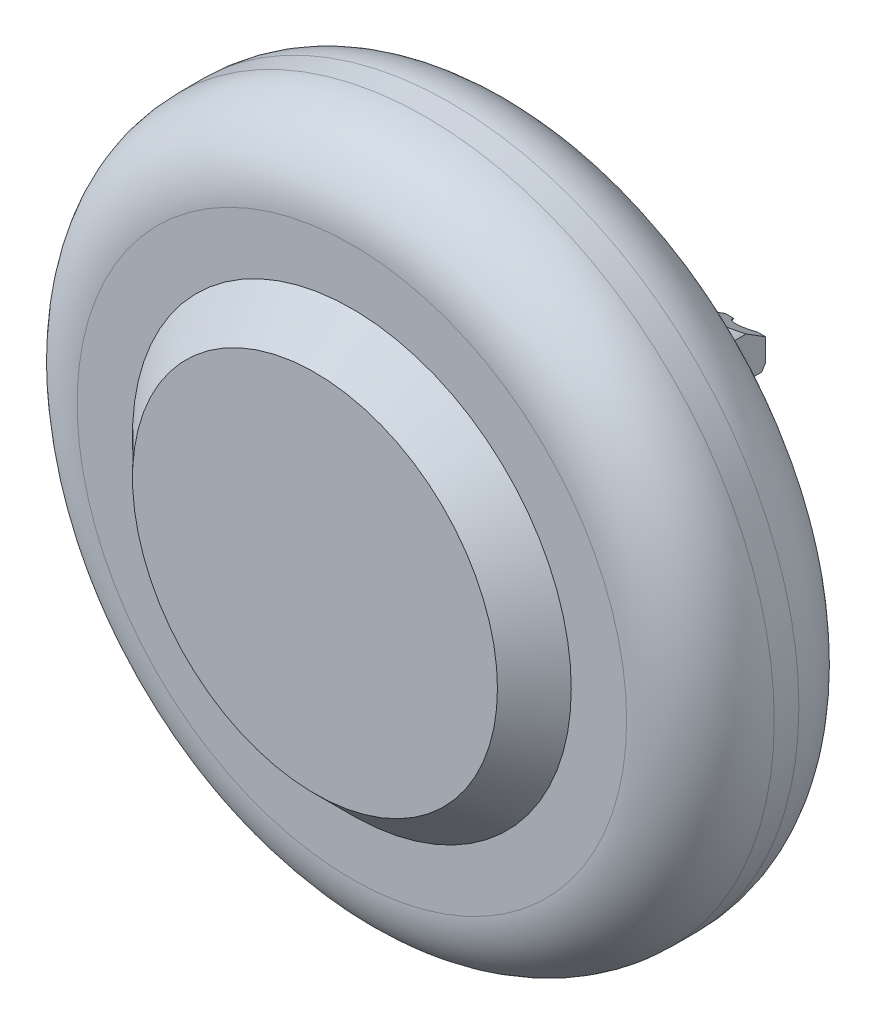
ISO-10303-21;
HEADER;
FILE_DESCRIPTION(('STEP AP214'),'2;1');
FILE_NAME('part.step','',(''),(''),'','','');
FILE_SCHEMA(('AUTOMOTIVE_DESIGN { 1 0 10303 214 1 1 1 1 }'));
ENDSEC;
DATA;
#1=APPLICATION_CONTEXT('core data for automotive mechanical design processes');
#2=APPLICATION_PROTOCOL_DEFINITION('international standard','automotive_design',2000,#1);
#3=PRODUCT_CONTEXT('',#1,'mechanical');
#4=PRODUCT('Part','Part','',(#3));
#5=PRODUCT_RELATED_PRODUCT_CATEGORY('part','',(#4));
#6=PRODUCT_DEFINITION_FORMATION('','',#4);
#7=PRODUCT_DEFINITION_CONTEXT('part definition',#1,'design');
#8=PRODUCT_DEFINITION('design','',#6,#7);
#9=PRODUCT_DEFINITION_SHAPE('','',#8);
#10=(LENGTH_UNIT() NAMED_UNIT(*) SI_UNIT(.MILLI.,.METRE.));
#11=(NAMED_UNIT(*) PLANE_ANGLE_UNIT() SI_UNIT($,.RADIAN.));
#12=(NAMED_UNIT(*) SI_UNIT($,.STERADIAN.) SOLID_ANGLE_UNIT());
#13=UNCERTAINTY_MEASURE_WITH_UNIT(LENGTH_MEASURE(1.E-05),#10,'distance_accuracy_value','');
#14=(GEOMETRIC_REPRESENTATION_CONTEXT(3) GLOBAL_UNCERTAINTY_ASSIGNED_CONTEXT((#13)) GLOBAL_UNIT_ASSIGNED_CONTEXT((#10,
#11,#12)) REPRESENTATION_CONTEXT('',''));
#15=CARTESIAN_POINT('',(0.,0.,0.));
#16=DIRECTION('',(0.,0.,1.));
#17=DIRECTION('',(1.,0.,0.));
#18=AXIS2_PLACEMENT_3D('',#15,#16,#17);
#19=CARTESIAN_POINT('',(0.,0.,-75.));
#20=DIRECTION('',(0.,0.,1.));
#21=DIRECTION('',(1.,0.,0.));
#22=AXIS2_PLACEMENT_3D('',#19,#20,#21);
#23=CYLINDRICAL_SURFACE('',#22,7.);
#24=CARTESIAN_POINT('',(0.,0.,-30.));
#25=DIRECTION('',(0.,0.,1.));
#26=DIRECTION('',(1.,0.,0.));
#27=AXIS2_PLACEMENT_3D('',#24,#25,#26);
#28=CIRCLE('',#27,7.);
#29=CARTESIAN_POINT('',(7.,0.,-30.));
#30=VERTEX_POINT('',#29);
#31=EDGE_CURVE('E125',#30,#30,#28,.F.);
#32=ORIENTED_EDGE('',*,*,#31,.T.);
#33=EDGE_LOOP('',(#32));
#34=FACE_BOUND('',#33,.T.);
#35=DIRECTION('',(0.,0.,1.));
#36=VECTOR('',#35,1.);
#37=CARTESIAN_POINT('',(4.925,4.97437181963713,-75.));
#38=LINE('',#37,#36);
#39=CARTESIAN_POINT('',(4.925,4.97437181963713,-70.2410050885806));
#40=VERTEX_POINT('',#39);
#41=CARTESIAN_POINT('',(4.925,4.97437181963713,-35.));
#42=VERTEX_POINT('',#41);
#43=EDGE_CURVE('E224',#40,#42,#38,.T.);
#44=ORIENTED_EDGE('',*,*,#43,.F.);
#45=CARTESIAN_POINT('',(0.,0.,-78.2));
#46=DIRECTION('',(0.,-0.847998304005088,0.52999894000318));
#47=DIRECTION('',(0.,0.52999894000318,0.847998304005088));
#48=AXIS2_PLACEMENT_3D('',#45,#46,#47);
#49=ELLIPSE('',#48,13.2075735848792,7.);
#50=CARTESIAN_POINT('',(-4.925,4.97437181963713,-70.2410050885806));
#51=VERTEX_POINT('',#50);
#52=EDGE_CURVE('E242',#51,#40,#49,.F.);
#53=ORIENTED_EDGE('',*,*,#52,.F.);
#54=DIRECTION('',(0.,0.,1.));
#55=VECTOR('',#54,1.);
#56=CARTESIAN_POINT('',(-4.925,4.97437181963713,-75.));
#57=LINE('',#56,#55);
#58=CARTESIAN_POINT('',(-4.925,4.97437181963713,-35.));
#59=VERTEX_POINT('',#58);
#60=EDGE_CURVE('E117',#59,#51,#57,.F.);
#61=ORIENTED_EDGE('',*,*,#60,.F.);
#62=CARTESIAN_POINT('',(0.,0.,-35.));
#63=DIRECTION('',(0.,0.,-1.));
#64=DIRECTION('',(-1.,0.,0.));
#65=AXIS2_PLACEMENT_3D('',#62,#63,#64);
#66=CIRCLE('',#65,7.);
#67=CARTESIAN_POINT('',(-4.925,-4.97437181963713,-35.));
#68=VERTEX_POINT('',#67);
#69=EDGE_CURVE('E127',#68,#59,#66,.T.);
#70=ORIENTED_EDGE('',*,*,#69,.F.);
#71=DIRECTION('',(0.,0.,1.));
#72=VECTOR('',#71,1.);
#73=CARTESIAN_POINT('',(-4.925,-4.97437181963713,-75.));
#74=LINE('',#73,#72);
#75=CARTESIAN_POINT('',(-4.925,-4.97437181963713,-74.0000000000001));
#76=VERTEX_POINT('',#75);
#77=EDGE_CURVE('E228',#76,#68,#74,.T.);
#78=ORIENTED_EDGE('',*,*,#77,.F.);
#79=CARTESIAN_POINT('',(0.,0.,-74.0000000000001));
#80=DIRECTION('',(0.,0.,-1.));
#81=DIRECTION('',(-1.,0.,0.));
#82=AXIS2_PLACEMENT_3D('',#79,#80,#81);
#83=CIRCLE('',#82,7.);
#84=CARTESIAN_POINT('',(4.925,-4.97437181963713,-74.0000000000001));
#85=VERTEX_POINT('',#84);
#86=EDGE_CURVE('E62',#76,#85,#83,.F.);
#87=ORIENTED_EDGE('',*,*,#86,.T.);
#88=DIRECTION('',(0.,0.,1.));
#89=VECTOR('',#88,1.);
#90=CARTESIAN_POINT('',(4.925,-4.97437181963713,-75.));
#91=LINE('',#90,#89);
#92=CARTESIAN_POINT('',(4.925,-4.97437181963713,-35.));
#93=VERTEX_POINT('',#92);
#94=EDGE_CURVE('E226',#93,#85,#91,.F.);
#95=ORIENTED_EDGE('',*,*,#94,.F.);
#96=EDGE_CURVE('E135',#42,#93,#66,.T.);
#97=ORIENTED_EDGE('',*,*,#96,.F.);
#98=EDGE_LOOP('',(#44,#53,#61,#70,#78,#87,#95,#97));
#99=FACE_BOUND('',#98,.T.);
#100=ADVANCED_FACE('F39',(#34,#99),#23,.T.);
#101=CARTESIAN_POINT('',(0.,0.,-75.));
#102=DIRECTION('',(0.,0.,-1.));
#103=DIRECTION('',(-1.,0.,0.));
#104=AXIS2_PLACEMENT_3D('',#101,#102,#103);
#105=PLANE('',#104);
#106=DIRECTION('',(1.,0.,0.));
#107=VECTOR('',#106,1.);
#108=CARTESIAN_POINT('',(-85.001,2.,-75.));
#109=LINE('',#108,#107);
#110=CARTESIAN_POINT('',(2.87228132326902,2.,-75.));
#111=VERTEX_POINT('',#110);
#112=CARTESIAN_POINT('',(4.925,2.,-75.));
#113=VERTEX_POINT('',#112);
#114=EDGE_CURVE('E54',#111,#113,#109,.T.);
#115=ORIENTED_EDGE('',*,*,#114,.T.);
#116=DIRECTION('',(0.,-1.,0.));
#117=VECTOR('',#116,1.);
#118=CARTESIAN_POINT('',(4.925,0.,-75.));
#119=LINE('',#118,#117);
#120=CARTESIAN_POINT('',(4.925,-3.42700671140307,-75.));
#121=VERTEX_POINT('',#120);
#122=EDGE_CURVE('E124',#113,#121,#119,.T.);
#123=ORIENTED_EDGE('',*,*,#122,.T.);
#124=CARTESIAN_POINT('',(0.,0.,-75.));
#125=DIRECTION('',(0.,0.,-1.));
#126=DIRECTION('',(-1.,0.,0.));
#127=AXIS2_PLACEMENT_3D('',#124,#125,#126);
#128=CIRCLE('',#127,6.00000000000014);
#129=CARTESIAN_POINT('',(-4.925,-3.42700671140307,-75.));
#130=VERTEX_POINT('',#129);
#131=EDGE_CURVE('E123',#121,#130,#128,.T.);
#132=ORIENTED_EDGE('',*,*,#131,.T.);
#133=DIRECTION('',(0.,1.,0.));
#134=VECTOR('',#133,1.);
#135=CARTESIAN_POINT('',(-4.925,0.,-75.));
#136=LINE('',#135,#134);
#137=CARTESIAN_POINT('',(-4.925,2.,-75.));
#138=VERTEX_POINT('',#137);
#139=EDGE_CURVE('E114',#130,#138,#136,.T.);
#140=ORIENTED_EDGE('',*,*,#139,.T.);
#141=CARTESIAN_POINT('',(-2.87228132326901,2.,-75.));
#142=VERTEX_POINT('',#141);
#143=EDGE_CURVE('E98',#138,#142,#109,.T.);
#144=ORIENTED_EDGE('',*,*,#143,.T.);
#145=CARTESIAN_POINT('',(0.,0.,-75.));
#146=DIRECTION('',(0.,0.,-1.));
#147=DIRECTION('',(-1.,0.,0.));
#148=AXIS2_PLACEMENT_3D('',#145,#146,#147);
#149=CIRCLE('',#148,3.5);
#150=EDGE_CURVE('E108',#111,#142,#149,.T.);
#151=ORIENTED_EDGE('',*,*,#150,.F.);
#152=EDGE_LOOP('',(#115,#123,#132,#140,#144,#151));
#153=FACE_BOUND('',#152,.T.);
#154=ADVANCED_FACE('F121',(#153),#105,.T.);
#155=CARTESIAN_POINT('',(0.,0.,21.));
#156=DIRECTION('',(0.,0.,-1.));
#157=DIRECTION('',(-1.,0.,0.));
#158=AXIS2_PLACEMENT_3D('',#155,#156,#157);
#159=CYLINDRICAL_SURFACE('',#158,85.);
#160=CARTESIAN_POINT('',(0.,0.,-3.00000000000001));
#161=DIRECTION('',(0.,0.,1.));
#162=DIRECTION('',(1.,0.,0.));
#163=AXIS2_PLACEMENT_3D('',#160,#161,#162);
#164=CIRCLE('',#163,85.);
#165=CARTESIAN_POINT('',(-85.,0.,-3.00000000000001));
#166=VERTEX_POINT('',#165);
#167=EDGE_CURVE('E401',#166,#166,#164,.T.);
#168=CARTESIAN_POINT('',(0.,0.,3.));
#169=DIRECTION('',(0.,0.,1.));
#170=DIRECTION('',(1.,0.,0.));
#171=AXIS2_PLACEMENT_3D('',#168,#169,#170);
#172=CIRCLE('',#171,85.);
#173=CARTESIAN_POINT('',(-85.,0.,3.));
#174=VERTEX_POINT('',#173);
#175=EDGE_CURVE('E167',#174,#174,#172,.F.);
#176=CARTESIAN_POINT('',(-85.,0.,-3.00000000000001));
#177=CARTESIAN_POINT('',(-85.,0.,-2.93750000000001));
#178=CARTESIAN_POINT('',(-85.,0.,-2.87500000000001));
#179=CARTESIAN_POINT('',(-85.,0.,-2.75000000000001));
#180=CARTESIAN_POINT('',(-85.,0.,-2.68750000000001));
#181=CARTESIAN_POINT('',(-85.,0.,-2.56250000000001));
#182=CARTESIAN_POINT('',(-85.,0.,-2.50000000000001));
#183=CARTESIAN_POINT('',(-85.,0.,-2.37500000000001));
#184=CARTESIAN_POINT('',(-85.,0.,-2.31250000000001));
#185=CARTESIAN_POINT('',(-85.,0.,-2.18750000000001));
#186=CARTESIAN_POINT('',(-85.,0.,-2.12500000000001));
#187=CARTESIAN_POINT('',(-85.,0.,-2.00000000000001));
#188=CARTESIAN_POINT('',(-85.,0.,-1.93750000000001));
#189=CARTESIAN_POINT('',(-85.,0.,-1.81250000000001));
#190=CARTESIAN_POINT('',(-85.,0.,-1.75000000000001));
#191=CARTESIAN_POINT('',(-85.,0.,-1.62500000000001));
#192=CARTESIAN_POINT('',(-85.,0.,-1.56250000000001));
#193=CARTESIAN_POINT('',(-85.,0.,-1.43750000000001));
#194=CARTESIAN_POINT('',(-85.,0.,-1.37500000000001));
#195=CARTESIAN_POINT('',(-85.,0.,-1.25000000000001));
#196=CARTESIAN_POINT('',(-85.,0.,-1.18750000000001));
#197=CARTESIAN_POINT('',(-85.,0.,-1.06250000000001));
#198=CARTESIAN_POINT('',(-85.,0.,-1.00000000000001));
#199=CARTESIAN_POINT('',(-85.,0.,-0.875000000000008));
#200=CARTESIAN_POINT('',(-85.,0.,-0.812500000000008));
#201=CARTESIAN_POINT('',(-85.,0.,-0.687500000000008));
#202=CARTESIAN_POINT('',(-85.,0.,-0.625000000000008));
#203=CARTESIAN_POINT('',(-85.,0.,-0.500000000000007));
#204=CARTESIAN_POINT('',(-85.,0.,-0.437500000000007));
#205=CARTESIAN_POINT('',(-85.,0.,-0.312500000000007));
#206=CARTESIAN_POINT('',(-85.,0.,-0.250000000000007));
#207=CARTESIAN_POINT('',(-85.,0.,-0.125000000000007));
#208=CARTESIAN_POINT('',(-85.,0.,-0.062500000000007));
#209=CARTESIAN_POINT('',(-85.,0.,0.0624999999999931));
#210=CARTESIAN_POINT('',(-85.,0.,0.124999999999993));
#211=CARTESIAN_POINT('',(-85.,0.,0.249999999999993));
#212=CARTESIAN_POINT('',(-85.,0.,0.312499999999993));
#213=CARTESIAN_POINT('',(-85.,0.,0.437499999999993));
#214=CARTESIAN_POINT('',(-85.,0.,0.499999999999994));
#215=CARTESIAN_POINT('',(-85.,0.,0.624999999999994));
#216=CARTESIAN_POINT('',(-85.,0.,0.687499999999994));
#217=CARTESIAN_POINT('',(-85.,0.,0.812499999999994));
#218=CARTESIAN_POINT('',(-85.,0.,0.874999999999994));
#219=CARTESIAN_POINT('',(-85.,0.,0.999999999999994));
#220=CARTESIAN_POINT('',(-85.,0.,1.06249999999999));
#221=CARTESIAN_POINT('',(-85.,0.,1.18749999999999));
#222=CARTESIAN_POINT('',(-85.,0.,1.24999999999999));
#223=CARTESIAN_POINT('',(-85.,0.,1.37499999999999));
#224=CARTESIAN_POINT('',(-85.,0.,1.43749999999999));
#225=CARTESIAN_POINT('',(-85.,0.,1.56249999999999));
#226=CARTESIAN_POINT('',(-85.,0.,1.62499999999999));
#227=CARTESIAN_POINT('',(-85.,0.,1.74999999999999));
#228=CARTESIAN_POINT('',(-85.,0.,1.81249999999999));
#229=CARTESIAN_POINT('',(-85.,0.,1.93749999999999));
#230=CARTESIAN_POINT('',(-85.,0.,1.99999999999999));
#231=CARTESIAN_POINT('',(-85.,0.,2.125));
#232=CARTESIAN_POINT('',(-85.,0.,2.1875));
#233=CARTESIAN_POINT('',(-85.,0.,2.3125));
#234=CARTESIAN_POINT('',(-85.,0.,2.375));
#235=CARTESIAN_POINT('',(-85.,0.,2.5));
#236=CARTESIAN_POINT('',(-85.,0.,2.5625));
#237=CARTESIAN_POINT('',(-85.,0.,2.6875));
#238=CARTESIAN_POINT('',(-85.,0.,2.75));
#239=CARTESIAN_POINT('',(-85.,0.,2.875));
#240=CARTESIAN_POINT('',(-85.,0.,2.9375));
#241=CARTESIAN_POINT('',(-85.,0.,3.));
#242=B_SPLINE_CURVE_WITH_KNOTS('',3,(#176,#177,#178,#179,#180,#181,#182,#183,#184,#185,#186,
#187,#188,#189,#190,#191,#192,#193,#194,#195,#196,#197,#198,#199,#200,#201,#202,#203,#204,#205,
#206,#207,#208,#209,#210,#211,#212,#213,#214,#215,#216,#217,#218,#219,#220,#221,#222,#223,#224,
#225,#226,#227,#228,#229,#230,#231,#232,#233,#234,#235,#236,#237,#238,#239,#240,#241),
.UNSPECIFIED.,.F.,.F.,(4,2,2,2,2,2,2,2,2,2,2,2,2,2,2,2,2,2,2,2,2,2,2,2,2,2,2,2,2,2,2,2,4),(0.,
0.1875,0.375,0.5625,0.750000000000001,0.937500000000001,1.125,1.3125,1.5,1.6875,1.875,2.0625,
2.25,2.4375,2.625,2.8125,3.,3.1875,3.375,3.5625,3.75,3.9375,4.125,4.3125,4.5,4.6875,4.875,
5.0625,5.25,5.4375,5.62500000000001,5.81250000000001,6.00000000000001),.UNSPECIFIED.);
#243=EDGE_CURVE('BSEAM180',#166,#174,#242,.T.);
#244=ORIENTED_EDGE('',*,*,#167,.T.);
#245=ORIENTED_EDGE('',*,*,#175,.T.);
#246=ORIENTED_EDGE('',*,*,#243,.T.);
#247=ORIENTED_EDGE('',*,*,#243,.F.);
#248=EDGE_LOOP('',(#244,#246,#245,#247));
#249=FACE_BOUND('',#248,.T.);
#250=ADVANCED_FACE('F180',(#249),#159,.T.);
#251=CARTESIAN_POINT('',(0.,0.,21.));
#252=DIRECTION('',(0.,0.,1.));
#253=DIRECTION('',(1.,0.,0.));
#254=AXIS2_PLACEMENT_3D('',#251,#252,#253);
#255=PLANE('',#254);
#256=CARTESIAN_POINT('',(0.,0.,21.));
#257=DIRECTION('',(0.,0.,1.));
#258=DIRECTION('',(1.,0.,0.));
#259=AXIS2_PLACEMENT_3D('',#256,#257,#258);
#260=CIRCLE('',#259,67.);
#261=CARTESIAN_POINT('',(67.,0.,21.));
#262=VERTEX_POINT('',#261);
#263=EDGE_CURVE('E12',#262,#262,#260,.T.);
#264=ORIENTED_EDGE('',*,*,#263,.T.);
#265=EDGE_LOOP('',(#264));
#266=FACE_BOUND('',#265,.T.);
#267=CARTESIAN_POINT('',(0.,0.,21.));
#268=DIRECTION('',(0.,0.,1.));
#269=DIRECTION('',(1.,0.,0.));
#270=AXIS2_PLACEMENT_3D('',#267,#268,#269);
#271=CIRCLE('',#270,53.4999999999999);
#272=CARTESIAN_POINT('',(53.4999999999999,0.,21.));
#273=VERTEX_POINT('',#272);
#274=EDGE_CURVE('E130',#273,#273,#271,.F.);
#275=ORIENTED_EDGE('',*,*,#274,.T.);
#276=EDGE_LOOP('',(#275));
#277=FACE_BOUND('',#276,.T.);
#278=ADVANCED_FACE('F194',(#266,#277),#255,.T.);
#279=CARTESIAN_POINT('',(0.,0.,-21.));
#280=DIRECTION('',(0.,0.,1.));
#281=DIRECTION('',(1.,0.,0.));
#282=AXIS2_PLACEMENT_3D('',#279,#280,#281);
#283=PLANE('',#282);
#284=CARTESIAN_POINT('',(0.,0.,-21.));
#285=DIRECTION('',(0.,0.,1.));
#286=DIRECTION('',(1.,0.,0.));
#287=AXIS2_PLACEMENT_3D('',#284,#285,#286);
#288=CIRCLE('',#287,67.);
#289=CARTESIAN_POINT('',(67.,0.,-21.));
#290=VERTEX_POINT('',#289);
#291=EDGE_CURVE('E47',#290,#290,#288,.F.);
#292=ORIENTED_EDGE('',*,*,#291,.T.);
#293=EDGE_LOOP('',(#292));
#294=FACE_BOUND('',#293,.T.);
#295=CARTESIAN_POINT('',(0.,0.,-21.));
#296=DIRECTION('',(0.,0.,1.));
#297=DIRECTION('',(1.,0.,0.));
#298=AXIS2_PLACEMENT_3D('',#295,#296,#297);
#299=CIRCLE('',#298,53.4999999999998);
#300=CARTESIAN_POINT('',(53.4999999999998,0.,-21.));
#301=VERTEX_POINT('',#300);
#302=EDGE_CURVE('E215',#301,#301,#299,.T.);
#303=ORIENTED_EDGE('',*,*,#302,.T.);
#304=EDGE_LOOP('',(#303));
#305=FACE_BOUND('',#304,.T.);
#306=ADVANCED_FACE('F192',(#294,#305),#283,.F.);
#307=CARTESIAN_POINT('',(0.,0.,-30.));
#308=DIRECTION('',(0.,0.,1.));
#309=DIRECTION('',(1.,0.,0.));
#310=AXIS2_PLACEMENT_3D('',#307,#308,#309);
#311=PLANE('',#310);
#312=ORIENTED_EDGE('',*,*,#31,.F.);
#313=EDGE_LOOP('',(#312));
#314=FACE_BOUND('',#313,.T.);
#315=CARTESIAN_POINT('',(0.,0.,-30.));
#316=DIRECTION('',(0.,0.,1.));
#317=DIRECTION('',(1.,0.,0.));
#318=AXIS2_PLACEMENT_3D('',#315,#316,#317);
#319=CIRCLE('',#318,44.4999999999999);
#320=CARTESIAN_POINT('',(44.4999999999999,0.,-30.));
#321=VERTEX_POINT('',#320);
#322=EDGE_CURVE('E212',#321,#321,#319,.F.);
#323=ORIENTED_EDGE('',*,*,#322,.T.);
#324=EDGE_LOOP('',(#323));
#325=FACE_BOUND('',#324,.T.);
#326=ADVANCED_FACE('F188',(#314,#325),#311,.F.);
#327=CARTESIAN_POINT('',(0.,0.,30.));
#328=DIRECTION('',(0.,0.,1.));
#329=DIRECTION('',(1.,0.,0.));
#330=AXIS2_PLACEMENT_3D('',#327,#328,#329);
#331=PLANE('',#330);
#332=CARTESIAN_POINT('',(0.,0.,30.));
#333=DIRECTION('',(0.,0.,1.));
#334=DIRECTION('',(1.,0.,0.));
#335=AXIS2_PLACEMENT_3D('',#332,#333,#334);
#336=CIRCLE('',#335,44.4999999999998);
#337=CARTESIAN_POINT('',(44.4999999999998,0.,30.));
#338=VERTEX_POINT('',#337);
#339=EDGE_CURVE('E217',#338,#338,#336,.T.);
#340=ORIENTED_EDGE('',*,*,#339,.T.);
#341=EDGE_LOOP('',(#340));
#342=FACE_BOUND('',#341,.T.);
#343=ADVANCED_FACE('F184',(#342),#331,.T.);
#344=CARTESIAN_POINT('',(0.,0.,-19.9999999999998));
#345=DIRECTION('',(0.,0.,1.));
#346=DIRECTION('',(1.,0.,0.));
#347=AXIS2_PLACEMENT_3D('',#344,#345,#346);
#348=CONICAL_SURFACE('',#347,54.5,0.785398163397443);
#349=ORIENTED_EDGE('',*,*,#322,.F.);
#350=EDGE_LOOP('',(#349));
#351=FACE_BOUND('',#350,.T.);
#352=ORIENTED_EDGE('',*,*,#302,.F.);
#353=EDGE_LOOP('',(#352));
#354=FACE_BOUND('',#353,.T.);
#355=ADVANCED_FACE('F187',(#351,#354),#348,.T.);
#356=CARTESIAN_POINT('',(0.,0.,30.));
#357=DIRECTION('',(0.,0.,-1.));
#358=DIRECTION('',(-1.,0.,0.));
#359=AXIS2_PLACEMENT_3D('',#356,#357,#358);
#360=CONICAL_SURFACE('',#359,44.4999999999998,0.785398163397453);
#361=ORIENTED_EDGE('',*,*,#274,.F.);
#362=EDGE_LOOP('',(#361));
#363=FACE_BOUND('',#362,.T.);
#364=ORIENTED_EDGE('',*,*,#339,.F.);
#365=EDGE_LOOP('',(#364));
#366=FACE_BOUND('',#365,.T.);
#367=ADVANCED_FACE('F156',(#363,#366),#360,.T.);
#368=CARTESIAN_POINT('',(-4.925,-7.,-35.));
#369=DIRECTION('',(-1.,0.,0.));
#370=DIRECTION('',(0.,0.,1.));
#371=AXIS2_PLACEMENT_3D('',#368,#369,#370);
#372=PLANE('',#371);
#373=DIRECTION('',(0.,-0.52999894000318,-0.847998304005088));
#374=VECTOR('',#373,1.);
#375=CARTESIAN_POINT('',(-4.925,7.,-67.));
#376=LINE('',#375,#374);
#377=EDGE_CURVE('E101',#51,#138,#376,.T.);
#378=ORIENTED_EDGE('',*,*,#377,.T.);
#379=ORIENTED_EDGE('',*,*,#139,.F.);
#380=CARTESIAN_POINT('',(-4.925,-3.42700671140307,-75.));
#381=CARTESIAN_POINT('',(-4.925,-3.56042711503983,-74.923766249084));
#382=CARTESIAN_POINT('',(-4.925,-3.69256080326343,-74.8453259303076));
#383=CARTESIAN_POINT('',(-4.925,-3.95445095261197,-74.684738669013));
#384=CARTESIAN_POINT('',(-4.925,-4.08420879474065,-74.6025939825376));
#385=CARTESIAN_POINT('',(-4.925,-4.34168500458051,-74.4352230873353));
#386=CARTESIAN_POINT('',(-4.925,-4.46940365742736,-74.3499973149678));
#387=CARTESIAN_POINT('',(-4.925,-4.72313154108369,-74.1768737445384));
#388=CARTESIAN_POINT('',(-4.925,-4.84913969979582,-74.0889743733002));
#389=CARTESIAN_POINT('',(-4.925,-4.97437181963713,-74.0000000000001));
#390=B_SPLINE_CURVE_WITH_KNOTS('',3,(#380,#381,#382,#383,#384,#385,#386,#387,#388,#389),
.UNSPECIFIED.,.F.,.F.,(4,2,2,2,4),(0.,0.460938138073399,0.921599248774839,1.3821953718742,
1.84306796773131),.UNSPECIFIED.);
#391=EDGE_CURVE('E137',#130,#76,#390,.T.);
#392=ORIENTED_EDGE('',*,*,#391,.T.);
#393=ORIENTED_EDGE('',*,*,#77,.T.);
#394=DIRECTION('',(0.,1.,0.));
#395=VECTOR('',#394,1.);
#396=CARTESIAN_POINT('',(-4.925,-7.,-35.));
#397=LINE('',#396,#395);
#398=EDGE_CURVE('E231',#68,#59,#397,.T.);
#399=ORIENTED_EDGE('',*,*,#398,.T.);
#400=ORIENTED_EDGE('',*,*,#60,.T.);
#401=EDGE_LOOP('',(#378,#379,#392,#393,#399,#400));
#402=FACE_BOUND('',#401,.T.);
#403=ADVANCED_FACE('F113',(#402),#372,.T.);
#404=CARTESIAN_POINT('',(0.,0.,-35.));
#405=DIRECTION('',(0.,0.,-1.));
#406=DIRECTION('',(-1.,0.,0.));
#407=AXIS2_PLACEMENT_3D('',#404,#405,#406);
#408=PLANE('',#407);
#409=ORIENTED_EDGE('',*,*,#69,.T.);
#410=ORIENTED_EDGE('',*,*,#398,.F.);
#411=EDGE_LOOP('',(#409,#410));
#412=FACE_BOUND('',#411,.T.);
#413=ADVANCED_FACE('F176',(#412),#408,.T.);
#414=ORIENTED_EDGE('',*,*,#96,.T.);
#415=DIRECTION('',(0.,-1.,0.));
#416=VECTOR('',#415,1.);
#417=CARTESIAN_POINT('',(4.925,-7.,-35.));
#418=LINE('',#417,#416);
#419=EDGE_CURVE('E233',#42,#93,#418,.T.);
#420=ORIENTED_EDGE('',*,*,#419,.F.);
#421=EDGE_LOOP('',(#414,#420));
#422=FACE_BOUND('',#421,.T.);
#423=ADVANCED_FACE('F172',(#422),#408,.T.);
#424=CARTESIAN_POINT('',(4.925,-7.,-35.));
#425=DIRECTION('',(1.,0.,0.));
#426=DIRECTION('',(0.,0.,-1.));
#427=AXIS2_PLACEMENT_3D('',#424,#425,#426);
#428=PLANE('',#427);
#429=DIRECTION('',(0.,-0.52999894000318,-0.847998304005088));
#430=VECTOR('',#429,1.);
#431=CARTESIAN_POINT('',(4.925,7.,-67.));
#432=LINE('',#431,#430);
#433=EDGE_CURVE('E118',#40,#113,#432,.T.);
#434=ORIENTED_EDGE('',*,*,#433,.F.);
#435=ORIENTED_EDGE('',*,*,#43,.T.);
#436=ORIENTED_EDGE('',*,*,#419,.T.);
#437=ORIENTED_EDGE('',*,*,#94,.T.);
#438=CARTESIAN_POINT('',(4.925,-4.97437181963713,-74.0000000000001));
#439=CARTESIAN_POINT('',(4.925,-4.84913969979583,-74.0889743733002));
#440=CARTESIAN_POINT('',(4.925,-4.7231315410837,-74.1768737445384));
#441=CARTESIAN_POINT('',(4.925,-4.46940365742737,-74.3499973149678));
#442=CARTESIAN_POINT('',(4.925,-4.34168500458051,-74.4352230873353));
#443=CARTESIAN_POINT('',(4.925,-4.08420879474065,-74.6025939825376));
#444=CARTESIAN_POINT('',(4.925,-3.95445095261197,-74.684738669013));
#445=CARTESIAN_POINT('',(4.925,-3.69256080326344,-74.8453259303076));
#446=CARTESIAN_POINT('',(4.925,-3.56042711503984,-74.923766249084));
#447=CARTESIAN_POINT('',(4.925,-3.42700671140308,-75.));
#448=B_SPLINE_CURVE_WITH_KNOTS('',3,(#438,#439,#440,#441,#442,#443,#444,#445,#446,#447),
.UNSPECIFIED.,.F.,.F.,(4,2,2,2,4),(0.,0.460872595857095,0.921468718956462,1.38212982965791,
1.84306796773131),.UNSPECIFIED.);
#449=EDGE_CURVE('E160',#85,#121,#448,.T.);
#450=ORIENTED_EDGE('',*,*,#449,.T.);
#451=ORIENTED_EDGE('',*,*,#122,.F.);
#452=EDGE_LOOP('',(#434,#435,#436,#437,#450,#451));
#453=FACE_BOUND('',#452,.T.);
#454=ADVANCED_FACE('F154',(#453),#428,.T.);
#455=CARTESIAN_POINT('',(0.,0.,-75.));
#456=DIRECTION('',(0.,0.,1.));
#457=DIRECTION('',(1.,0.,0.));
#458=AXIS2_PLACEMENT_3D('',#455,#456,#457);
#459=CONICAL_SURFACE('',#458,6.00000000000014,0.785398163397453);
#460=ORIENTED_EDGE('',*,*,#449,.F.);
#461=ORIENTED_EDGE('',*,*,#86,.F.);
#462=ORIENTED_EDGE('',*,*,#391,.F.);
#463=ORIENTED_EDGE('',*,*,#131,.F.);
#464=EDGE_LOOP('',(#460,#461,#462,#463));
#465=FACE_BOUND('',#464,.T.);
#466=ADVANCED_FACE('F149',(#465),#459,.T.);
#467=CARTESIAN_POINT('',(0.,0.,-30.));
#468=DIRECTION('',(0.,0.,-1.));
#469=DIRECTION('',(-1.,0.,0.));
#470=AXIS2_PLACEMENT_3D('',#467,#468,#469);
#471=CYLINDRICAL_SURFACE('',#470,3.5);
#472=CARTESIAN_POINT('',(0.,0.,-30.));
#473=DIRECTION('',(0.,0.,-1.));
#474=DIRECTION('',(-1.,0.,0.));
#475=AXIS2_PLACEMENT_3D('',#472,#473,#474);
#476=CIRCLE('',#475,3.5);
#477=CARTESIAN_POINT('',(-3.5,0.,-30.));
#478=VERTEX_POINT('',#477);
#479=EDGE_CURVE('E236',#478,#478,#476,.T.);
#480=ORIENTED_EDGE('',*,*,#479,.F.);
#481=EDGE_LOOP('',(#480));
#482=FACE_BOUND('',#481,.T.);
#483=ORIENTED_EDGE('',*,*,#150,.T.);
#484=CARTESIAN_POINT('',(0.,0.,-78.2));
#485=DIRECTION('',(0.,-0.847998304005088,0.52999894000318));
#486=DIRECTION('',(0.,-0.52999894000318,-0.847998304005088));
#487=AXIS2_PLACEMENT_3D('',#484,#485,#486);
#488=ELLIPSE('',#487,6.60378679243962,3.5);
#489=EDGE_CURVE('E103',#111,#142,#488,.T.);
#490=ORIENTED_EDGE('',*,*,#489,.F.);
#491=EDGE_LOOP('',(#483,#490));
#492=FACE_BOUND('',#491,.T.);
#493=ADVANCED_FACE('F153',(#482,#492),#471,.F.);
#494=CARTESIAN_POINT('',(0.,0.,-30.));
#495=DIRECTION('',(0.,0.,-1.));
#496=DIRECTION('',(-1.,0.,0.));
#497=AXIS2_PLACEMENT_3D('',#494,#495,#496);
#498=PLANE('',#497);
#499=ORIENTED_EDGE('',*,*,#479,.T.);
#500=EDGE_LOOP('',(#499));
#501=FACE_BOUND('',#500,.T.);
#502=ADVANCED_FACE('F356',(#501),#498,.T.);
#503=CARTESIAN_POINT('',(0.,0.,-3.));
#504=DIRECTION('',(0.,0.,1.));
#505=DIRECTION('',(1.,0.,0.));
#506=AXIS2_PLACEMENT_3D('',#503,#504,#505);
#507=TOROIDAL_SURFACE('',#506,67.,18.);
#508=ORIENTED_EDGE('',*,*,#291,.F.);
#509=EDGE_LOOP('',(#508));
#510=FACE_BOUND('',#509,.T.);
#511=ORIENTED_EDGE('',*,*,#167,.F.);
#512=EDGE_LOOP('',(#511));
#513=FACE_BOUND('',#512,.T.);
#514=ADVANCED_FACE('F158',(#510,#513),#507,.T.);
#515=CARTESIAN_POINT('',(0.,0.,3.));
#516=DIRECTION('',(0.,0.,1.));
#517=DIRECTION('',(1.,0.,0.));
#518=AXIS2_PLACEMENT_3D('',#515,#516,#517);
#519=TOROIDAL_SURFACE('',#518,67.,18.);
#520=ORIENTED_EDGE('',*,*,#175,.F.);
#521=EDGE_LOOP('',(#520));
#522=FACE_BOUND('',#521,.T.);
#523=ORIENTED_EDGE('',*,*,#263,.F.);
#524=EDGE_LOOP('',(#523));
#525=FACE_BOUND('',#524,.T.);
#526=ADVANCED_FACE('F41',(#522,#525),#519,.T.);
#527=CARTESIAN_POINT('',(-85.001,7.,-67.));
#528=DIRECTION('',(0.,-0.847998304005088,0.52999894000318));
#529=DIRECTION('',(0.,-0.52999894000318,-0.847998304005088));
#530=AXIS2_PLACEMENT_3D('',#527,#528,#529);
#531=PLANE('',#530);
#532=ORIENTED_EDGE('',*,*,#52,.T.);
#533=ORIENTED_EDGE('',*,*,#433,.T.);
#534=ORIENTED_EDGE('',*,*,#114,.F.);
#535=ORIENTED_EDGE('',*,*,#489,.T.);
#536=ORIENTED_EDGE('',*,*,#143,.F.);
#537=ORIENTED_EDGE('',*,*,#377,.F.);
#538=EDGE_LOOP('',(#532,#533,#534,#535,#536,#537));
#539=FACE_BOUND('',#538,.T.);
#540=ADVANCED_FACE('F100',(#539),#531,.F.);
#541=CLOSED_SHELL('',(#100,#154,#250,#278,#306,#326,#343,#355,#367,#403,#413,#423,#454,#466,
#493,#502,#514,#526,#540));
#542=MANIFOLD_SOLID_BREP('B2',#541);
#543=ADVANCED_BREP_SHAPE_REPRESENTATION('',(#18,#542),#14);
#544=SHAPE_DEFINITION_REPRESENTATION(#9,#543);
ENDSEC;
END-ISO-10303-21;
